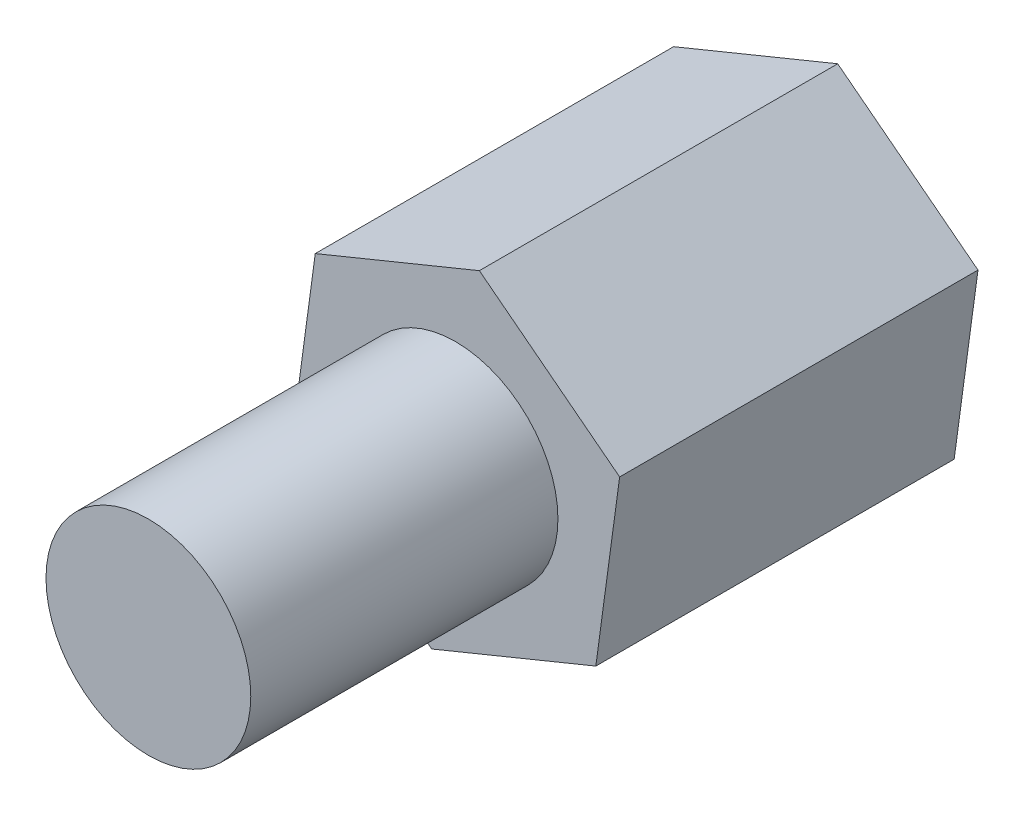
ISO-10303-21;
HEADER;
FILE_DESCRIPTION(('STEP AP214'),'2;1');
FILE_NAME('part.step','',(''),(''),'','','');
FILE_SCHEMA(('AUTOMOTIVE_DESIGN { 1 0 10303 214 1 1 1 1 }'));
ENDSEC;
DATA;
#1=APPLICATION_CONTEXT('core data for automotive mechanical design processes');
#2=APPLICATION_PROTOCOL_DEFINITION('international standard','automotive_design',2000,#1);
#3=PRODUCT_CONTEXT('',#1,'mechanical');
#4=PRODUCT('Part','Part','',(#3));
#5=PRODUCT_RELATED_PRODUCT_CATEGORY('part','',(#4));
#6=PRODUCT_DEFINITION_FORMATION('','',#4);
#7=PRODUCT_DEFINITION_CONTEXT('part definition',#1,'design');
#8=PRODUCT_DEFINITION('design','',#6,#7);
#9=PRODUCT_DEFINITION_SHAPE('','',#8);
#10=(LENGTH_UNIT() NAMED_UNIT(*) SI_UNIT(.MILLI.,.METRE.));
#11=(NAMED_UNIT(*) PLANE_ANGLE_UNIT() SI_UNIT($,.RADIAN.));
#12=(NAMED_UNIT(*) SI_UNIT($,.STERADIAN.) SOLID_ANGLE_UNIT());
#13=UNCERTAINTY_MEASURE_WITH_UNIT(LENGTH_MEASURE(1.E-05),#10,'distance_accuracy_value','');
#14=(GEOMETRIC_REPRESENTATION_CONTEXT(3) GLOBAL_UNCERTAINTY_ASSIGNED_CONTEXT((#13)) GLOBAL_UNIT_ASSIGNED_CONTEXT((#10,
#11,#12)) REPRESENTATION_CONTEXT('',''));
#15=CARTESIAN_POINT('',(0.,0.,0.));
#16=DIRECTION('',(0.,0.,1.));
#17=DIRECTION('',(1.,0.,0.));
#18=AXIS2_PLACEMENT_3D('',#15,#16,#17);
#19=CARTESIAN_POINT('',(-0.465240047696353,-3.43271782965328,7.));
#20=DIRECTION('',(-0.379160128826499,0.92533107410714,0.));
#21=DIRECTION('',(-0.92533107410714,-0.379160128826499,0.));
#22=AXIS2_PLACEMENT_3D('',#19,#20,#21);
#23=PLANE('',#22);
#24=DIRECTION('',(0.92533107410714,0.379160128826499,0.));
#25=VECTOR('',#24,1.);
#26=CARTESIAN_POINT('',(-0.465240047696353,-3.43271782965328,0.));
#27=LINE('',#26,#25);
#28=CARTESIAN_POINT('',(-0.465240047696353,-3.43271782965328,0.));
#29=VERTEX_POINT('',#28);
#30=CARTESIAN_POINT('',(2.74020082065534,-2.11926861498956,0.));
#31=VERTEX_POINT('',#30);
#32=EDGE_CURVE('E123',#29,#31,#27,.T.);
#33=ORIENTED_EDGE('',*,*,#32,.T.);
#34=DIRECTION('',(0.,0.,-1.));
#35=VECTOR('',#34,1.);
#36=CARTESIAN_POINT('',(2.74020082065534,-2.11926861498956,7.));
#37=LINE('',#36,#35);
#38=CARTESIAN_POINT('',(2.74020082065534,-2.11926861498956,7.));
#39=VERTEX_POINT('',#38);
#40=EDGE_CURVE('E40',#39,#31,#37,.T.);
#41=ORIENTED_EDGE('',*,*,#40,.F.);
#42=DIRECTION('',(0.92533107410714,0.379160128826499,0.));
#43=VECTOR('',#42,1.);
#44=CARTESIAN_POINT('',(-0.465240047696353,-3.43271782965328,7.));
#45=LINE('',#44,#43);
#46=CARTESIAN_POINT('',(-0.465240047696353,-3.43271782965328,7.));
#47=VERTEX_POINT('',#46);
#48=EDGE_CURVE('E134',#47,#39,#45,.T.);
#49=ORIENTED_EDGE('',*,*,#48,.F.);
#50=DIRECTION('',(0.,0.,-1.));
#51=VECTOR('',#50,1.);
#52=CARTESIAN_POINT('',(-0.465240047696353,-3.43271782965328,7.));
#53=LINE('',#52,#51);
#54=EDGE_CURVE('E119',#47,#29,#53,.T.);
#55=ORIENTED_EDGE('',*,*,#54,.T.);
#56=EDGE_LOOP('',(#33,#41,#49,#55));
#57=FACE_BOUND('',#56,.T.);
#58=ADVANCED_FACE('F37',(#57),#23,.F.);
#59=CARTESIAN_POINT('',(2.74020082065534,-2.11926861498956,7.));
#60=DIRECTION('',(-0.990940281501173,0.134303233387642,0.));
#61=DIRECTION('',(-0.134303233387642,-0.990940281501174,0.));
#62=AXIS2_PLACEMENT_3D('',#59,#60,#61);
#63=PLANE('',#62);
#64=DIRECTION('',(0.134303233387642,0.990940281501173,0.));
#65=VECTOR('',#64,1.);
#66=CARTESIAN_POINT('',(2.74020082065534,-2.11926861498956,0.));
#67=LINE('',#66,#65);
#68=CARTESIAN_POINT('',(3.2054408683517,1.31344921466371,0.));
#69=VERTEX_POINT('',#68);
#70=EDGE_CURVE('E126',#31,#69,#67,.T.);
#71=ORIENTED_EDGE('',*,*,#70,.T.);
#72=DIRECTION('',(0.,0.,-1.));
#73=VECTOR('',#72,1.);
#74=CARTESIAN_POINT('',(3.2054408683517,1.31344921466371,7.));
#75=LINE('',#74,#73);
#76=CARTESIAN_POINT('',(3.2054408683517,1.31344921466371,7.));
#77=VERTEX_POINT('',#76);
#78=EDGE_CURVE('E137',#77,#69,#75,.T.);
#79=ORIENTED_EDGE('',*,*,#78,.F.);
#80=DIRECTION('',(0.134303233387642,0.990940281501173,0.));
#81=VECTOR('',#80,1.);
#82=CARTESIAN_POINT('',(2.74020082065534,-2.11926861498956,7.));
#83=LINE('',#82,#81);
#84=EDGE_CURVE('E92',#39,#77,#83,.T.);
#85=ORIENTED_EDGE('',*,*,#84,.F.);
#86=ORIENTED_EDGE('',*,*,#40,.T.);
#87=EDGE_LOOP('',(#71,#79,#85,#86));
#88=FACE_BOUND('',#87,.T.);
#89=ADVANCED_FACE('F142',(#88),#63,.F.);
#90=CARTESIAN_POINT('',(3.2054408683517,1.31344921466371,7.));
#91=DIRECTION('',(-0.611780152674675,-0.791027840719498,0.));
#92=DIRECTION('',(0.791027840719498,-0.611780152674675,0.));
#93=AXIS2_PLACEMENT_3D('',#90,#91,#92);
#94=PLANE('',#93);
#95=DIRECTION('',(-0.791027840719498,0.611780152674675,0.));
#96=VECTOR('',#95,1.);
#97=CARTESIAN_POINT('',(3.2054408683517,1.31344921466371,0.));
#98=LINE('',#97,#96);
#99=CARTESIAN_POINT('',(0.465240047696353,3.43271782965328,0.));
#100=VERTEX_POINT('',#99);
#101=EDGE_CURVE('E129',#69,#100,#98,.T.);
#102=ORIENTED_EDGE('',*,*,#101,.T.);
#103=DIRECTION('',(0.,0.,-1.));
#104=VECTOR('',#103,1.);
#105=CARTESIAN_POINT('',(0.465240047696353,3.43271782965328,7.));
#106=LINE('',#105,#104);
#107=CARTESIAN_POINT('',(0.465240047696353,3.43271782965328,7.));
#108=VERTEX_POINT('',#107);
#109=EDGE_CURVE('E114',#108,#100,#106,.T.);
#110=ORIENTED_EDGE('',*,*,#109,.F.);
#111=DIRECTION('',(-0.791027840719498,0.611780152674675,0.));
#112=VECTOR('',#111,1.);
#113=CARTESIAN_POINT('',(3.2054408683517,1.31344921466371,7.));
#114=LINE('',#113,#112);
#115=EDGE_CURVE('E105',#77,#108,#114,.T.);
#116=ORIENTED_EDGE('',*,*,#115,.F.);
#117=ORIENTED_EDGE('',*,*,#78,.T.);
#118=EDGE_LOOP('',(#102,#110,#116,#117));
#119=FACE_BOUND('',#118,.T.);
#120=ADVANCED_FACE('F148',(#119),#94,.F.);
#121=CARTESIAN_POINT('',(0.465240047696353,3.43271782965328,7.));
#122=DIRECTION('',(0.379160128826498,-0.92533107410714,0.));
#123=DIRECTION('',(0.92533107410714,0.379160128826498,0.));
#124=AXIS2_PLACEMENT_3D('',#121,#122,#123);
#125=PLANE('',#124);
#126=DIRECTION('',(-0.92533107410714,-0.379160128826498,0.));
#127=VECTOR('',#126,1.);
#128=CARTESIAN_POINT('',(0.465240047696353,3.43271782965328,0.));
#129=LINE('',#128,#127);
#130=CARTESIAN_POINT('',(-2.74020082065534,2.11926861498956,0.));
#131=VERTEX_POINT('',#130);
#132=EDGE_CURVE('E113',#100,#131,#129,.T.);
#133=ORIENTED_EDGE('',*,*,#132,.T.);
#134=DIRECTION('',(0.,0.,-1.));
#135=VECTOR('',#134,1.);
#136=CARTESIAN_POINT('',(-2.74020082065534,2.11926861498956,7.));
#137=LINE('',#136,#135);
#138=CARTESIAN_POINT('',(-2.74020082065534,2.11926861498956,7.));
#139=VERTEX_POINT('',#138);
#140=EDGE_CURVE('E110',#139,#131,#137,.T.);
#141=ORIENTED_EDGE('',*,*,#140,.F.);
#142=DIRECTION('',(-0.92533107410714,-0.379160128826498,0.));
#143=VECTOR('',#142,1.);
#144=CARTESIAN_POINT('',(0.465240047696353,3.43271782965328,7.));
#145=LINE('',#144,#143);
#146=EDGE_CURVE('E99',#108,#139,#145,.T.);
#147=ORIENTED_EDGE('',*,*,#146,.F.);
#148=ORIENTED_EDGE('',*,*,#109,.T.);
#149=EDGE_LOOP('',(#133,#141,#147,#148));
#150=FACE_BOUND('',#149,.T.);
#151=ADVANCED_FACE('F111',(#150),#125,.F.);
#152=CARTESIAN_POINT('',(-2.74020082065534,2.11926861498956,7.));
#153=DIRECTION('',(0.990940281501173,-0.134303233387642,0.));
#154=DIRECTION('',(0.134303233387642,0.990940281501173,0.));
#155=AXIS2_PLACEMENT_3D('',#152,#153,#154);
#156=PLANE('',#155);
#157=DIRECTION('',(-0.134303233387642,-0.990940281501173,0.));
#158=VECTOR('',#157,1.);
#159=CARTESIAN_POINT('',(-2.74020082065534,2.11926861498956,0.));
#160=LINE('',#159,#158);
#161=CARTESIAN_POINT('',(-3.2054408683517,-1.31344921466371,0.));
#162=VERTEX_POINT('',#161);
#163=EDGE_CURVE('E77',#131,#162,#160,.T.);
#164=ORIENTED_EDGE('',*,*,#163,.T.);
#165=DIRECTION('',(0.,0.,-1.));
#166=VECTOR('',#165,1.);
#167=CARTESIAN_POINT('',(-3.2054408683517,-1.31344921466371,7.));
#168=LINE('',#167,#166);
#169=CARTESIAN_POINT('',(-3.2054408683517,-1.31344921466371,7.));
#170=VERTEX_POINT('',#169);
#171=EDGE_CURVE('E115',#170,#162,#168,.T.);
#172=ORIENTED_EDGE('',*,*,#171,.F.);
#173=DIRECTION('',(-0.134303233387642,-0.990940281501173,0.));
#174=VECTOR('',#173,1.);
#175=CARTESIAN_POINT('',(-2.74020082065534,2.11926861498956,7.));
#176=LINE('',#175,#174);
#177=EDGE_CURVE('E103',#139,#170,#176,.T.);
#178=ORIENTED_EDGE('',*,*,#177,.F.);
#179=ORIENTED_EDGE('',*,*,#140,.T.);
#180=EDGE_LOOP('',(#164,#172,#178,#179));
#181=FACE_BOUND('',#180,.T.);
#182=ADVANCED_FACE('F117',(#181),#156,.F.);
#183=CARTESIAN_POINT('',(-3.2054408683517,-1.31344921466371,7.));
#184=DIRECTION('',(0.611780152674675,0.791027840719498,0.));
#185=DIRECTION('',(-0.791027840719498,0.611780152674675,0.));
#186=AXIS2_PLACEMENT_3D('',#183,#184,#185);
#187=PLANE('',#186);
#188=DIRECTION('',(0.791027840719498,-0.611780152674675,0.));
#189=VECTOR('',#188,1.);
#190=CARTESIAN_POINT('',(-3.2054408683517,-1.31344921466371,0.));
#191=LINE('',#190,#189);
#192=EDGE_CURVE('E83',#162,#29,#191,.T.);
#193=ORIENTED_EDGE('',*,*,#192,.T.);
#194=ORIENTED_EDGE('',*,*,#54,.F.);
#195=DIRECTION('',(0.791027840719498,-0.611780152674675,0.));
#196=VECTOR('',#195,1.);
#197=CARTESIAN_POINT('',(-3.2054408683517,-1.31344921466371,7.));
#198=LINE('',#197,#196);
#199=EDGE_CURVE('E54',#170,#47,#198,.T.);
#200=ORIENTED_EDGE('',*,*,#199,.F.);
#201=ORIENTED_EDGE('',*,*,#171,.T.);
#202=EDGE_LOOP('',(#193,#194,#200,#201));
#203=FACE_BOUND('',#202,.T.);
#204=ADVANCED_FACE('F179',(#203),#187,.F.);
#205=CARTESIAN_POINT('',(0.,0.,7.));
#206=DIRECTION('',(0.,0.,1.));
#207=DIRECTION('',(1.,0.,0.));
#208=AXIS2_PLACEMENT_3D('',#205,#206,#207);
#209=PLANE('',#208);
#210=CARTESIAN_POINT('',(0.,0.,7.));
#211=DIRECTION('',(0.,0.,1.));
#212=DIRECTION('',(1.,0.,0.));
#213=AXIS2_PLACEMENT_3D('',#210,#211,#212);
#214=CIRCLE('',#213,2.);
#215=CARTESIAN_POINT('',(2.,0.,7.));
#216=VERTEX_POINT('',#215);
#217=EDGE_CURVE('E11',#216,#216,#214,.T.);
#218=ORIENTED_EDGE('',*,*,#217,.F.);
#219=EDGE_LOOP('',(#218));
#220=FACE_BOUND('',#219,.T.);
#221=ORIENTED_EDGE('',*,*,#48,.T.);
#222=ORIENTED_EDGE('',*,*,#84,.T.);
#223=ORIENTED_EDGE('',*,*,#115,.T.);
#224=ORIENTED_EDGE('',*,*,#146,.T.);
#225=ORIENTED_EDGE('',*,*,#177,.T.);
#226=ORIENTED_EDGE('',*,*,#199,.T.);
#227=EDGE_LOOP('',(#221,#222,#223,#224,#225,#226));
#228=FACE_BOUND('',#227,.T.);
#229=ADVANCED_FACE('F101',(#220,#228),#209,.T.);
#230=CARTESIAN_POINT('',(0.,0.,0.));
#231=DIRECTION('',(0.,0.,1.));
#232=DIRECTION('',(1.,0.,0.));
#233=AXIS2_PLACEMENT_3D('',#230,#231,#232);
#234=PLANE('',#233);
#235=CARTESIAN_POINT('',(0.,0.,0.));
#236=DIRECTION('',(0.,0.,-1.));
#237=DIRECTION('',(-1.,0.,0.));
#238=AXIS2_PLACEMENT_3D('',#235,#236,#237);
#239=CIRCLE('',#238,2.);
#240=CARTESIAN_POINT('',(-2.,0.,0.));
#241=VERTEX_POINT('',#240);
#242=EDGE_CURVE('E155',#241,#241,#239,.T.);
#243=ORIENTED_EDGE('',*,*,#242,.F.);
#244=EDGE_LOOP('',(#243));
#245=FACE_BOUND('',#244,.T.);
#246=ORIENTED_EDGE('',*,*,#32,.F.);
#247=ORIENTED_EDGE('',*,*,#192,.F.);
#248=ORIENTED_EDGE('',*,*,#163,.F.);
#249=ORIENTED_EDGE('',*,*,#132,.F.);
#250=ORIENTED_EDGE('',*,*,#101,.F.);
#251=ORIENTED_EDGE('',*,*,#70,.F.);
#252=EDGE_LOOP('',(#246,#247,#248,#249,#250,#251));
#253=FACE_BOUND('',#252,.T.);
#254=ADVANCED_FACE('F147',(#245,#253),#234,.F.);
#255=CARTESIAN_POINT('',(0.,0.,13.));
#256=DIRECTION('',(0.,0.,-1.));
#257=DIRECTION('',(-1.,0.,0.));
#258=AXIS2_PLACEMENT_3D('',#255,#256,#257);
#259=CYLINDRICAL_SURFACE('',#258,2.);
#260=CARTESIAN_POINT('',(0.,0.,13.));
#261=DIRECTION('',(0.,0.,1.));
#262=DIRECTION('',(1.,0.,0.));
#263=AXIS2_PLACEMENT_3D('',#260,#261,#262);
#264=CIRCLE('',#263,2.);
#265=CARTESIAN_POINT('',(2.,0.,13.));
#266=VERTEX_POINT('',#265);
#267=EDGE_CURVE('E127',#266,#266,#264,.T.);
#268=ORIENTED_EDGE('',*,*,#267,.F.);
#269=EDGE_LOOP('',(#268));
#270=FACE_BOUND('',#269,.T.);
#271=ORIENTED_EDGE('',*,*,#217,.T.);
#272=EDGE_LOOP('',(#271));
#273=FACE_BOUND('',#272,.T.);
#274=ADVANCED_FACE('F171',(#270,#273),#259,.T.);
#275=CARTESIAN_POINT('',(0.,0.,13.));
#276=DIRECTION('',(0.,0.,1.));
#277=DIRECTION('',(1.,0.,0.));
#278=AXIS2_PLACEMENT_3D('',#275,#276,#277);
#279=PLANE('',#278);
#280=ORIENTED_EDGE('',*,*,#267,.T.);
#281=EDGE_LOOP('',(#280));
#282=FACE_BOUND('',#281,.T.);
#283=ADVANCED_FACE('F166',(#282),#279,.T.);
#284=CARTESIAN_POINT('',(0.,0.,4.));
#285=DIRECTION('',(0.,0.,-1.));
#286=DIRECTION('',(-1.,0.,0.));
#287=AXIS2_PLACEMENT_3D('',#284,#285,#286);
#288=CYLINDRICAL_SURFACE('',#287,2.);
#289=CARTESIAN_POINT('',(0.,0.,4.));
#290=DIRECTION('',(0.,0.,-1.));
#291=DIRECTION('',(-1.,0.,0.));
#292=AXIS2_PLACEMENT_3D('',#289,#290,#291);
#293=CIRCLE('',#292,2.);
#294=CARTESIAN_POINT('',(-2.,0.,4.));
#295=VERTEX_POINT('',#294);
#296=EDGE_CURVE('E154',#295,#295,#293,.T.);
#297=ORIENTED_EDGE('',*,*,#296,.F.);
#298=EDGE_LOOP('',(#297));
#299=FACE_BOUND('',#298,.T.);
#300=ORIENTED_EDGE('',*,*,#242,.T.);
#301=EDGE_LOOP('',(#300));
#302=FACE_BOUND('',#301,.T.);
#303=ADVANCED_FACE('F163',(#299,#302),#288,.F.);
#304=CARTESIAN_POINT('',(0.,0.,4.));
#305=DIRECTION('',(0.,0.,-1.));
#306=DIRECTION('',(-1.,0.,0.));
#307=AXIS2_PLACEMENT_3D('',#304,#305,#306);
#308=PLANE('',#307);
#309=ORIENTED_EDGE('',*,*,#296,.T.);
#310=EDGE_LOOP('',(#309));
#311=FACE_BOUND('',#310,.T.);
#312=ADVANCED_FACE('F161',(#311),#308,.T.);
#313=CLOSED_SHELL('',(#58,#89,#120,#151,#182,#204,#229,#254,#274,#283,#303,#312));
#314=MANIFOLD_SOLID_BREP('B2',#313);
#315=ADVANCED_BREP_SHAPE_REPRESENTATION('',(#18,#314),#14);
#316=SHAPE_DEFINITION_REPRESENTATION(#9,#315);
ENDSEC;
END-ISO-10303-21;
